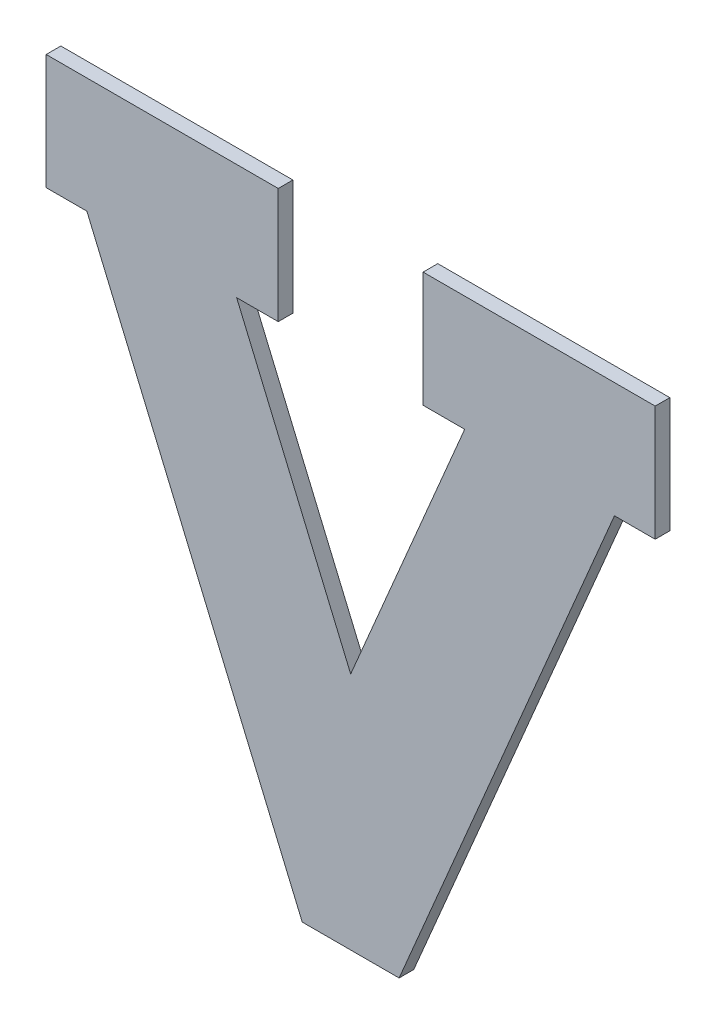
ISO-10303-21;
HEADER;
FILE_DESCRIPTION(('STEP AP214'),'2;1');
FILE_NAME('part.step','',(''),(''),'','','');
FILE_SCHEMA(('AUTOMOTIVE_DESIGN { 1 0 10303 214 1 1 1 1 }'));
ENDSEC;
DATA;
#1=APPLICATION_CONTEXT('core data for automotive mechanical design processes');
#2=APPLICATION_PROTOCOL_DEFINITION('international standard','automotive_design',2000,#1);
#3=PRODUCT_CONTEXT('',#1,'mechanical');
#4=PRODUCT('Part','Part','',(#3));
#5=PRODUCT_RELATED_PRODUCT_CATEGORY('part','',(#4));
#6=PRODUCT_DEFINITION_FORMATION('','',#4);
#7=PRODUCT_DEFINITION_CONTEXT('part definition',#1,'design');
#8=PRODUCT_DEFINITION('design','',#6,#7);
#9=PRODUCT_DEFINITION_SHAPE('','',#8);
#10=(LENGTH_UNIT() NAMED_UNIT(*) SI_UNIT(.MILLI.,.METRE.));
#11=(NAMED_UNIT(*) PLANE_ANGLE_UNIT() SI_UNIT($,.RADIAN.));
#12=(NAMED_UNIT(*) SI_UNIT($,.STERADIAN.) SOLID_ANGLE_UNIT());
#13=UNCERTAINTY_MEASURE_WITH_UNIT(LENGTH_MEASURE(1.E-05),#10,'distance_accuracy_value','');
#14=(GEOMETRIC_REPRESENTATION_CONTEXT(3) GLOBAL_UNCERTAINTY_ASSIGNED_CONTEXT((#13)) GLOBAL_UNIT_ASSIGNED_CONTEXT((#10,
#11,#12)) REPRESENTATION_CONTEXT('',''));
#15=CARTESIAN_POINT('',(0.,0.,0.));
#16=DIRECTION('',(0.,0.,1.));
#17=DIRECTION('',(1.,0.,0.));
#18=AXIS2_PLACEMENT_3D('',#15,#16,#17);
#19=CARTESIAN_POINT('',(203.379474991079,86.2207250585624,12.7));
#20=DIRECTION('',(-0.920681809264998,-0.39031398397768,0.));
#21=DIRECTION('',(0.390313983977681,-0.920681809264999,0.));
#22=AXIS2_PLACEMENT_3D('',#19,#20,#21);
#23=PLANE('',#22);
#24=DIRECTION('',(-0.390313983977681,0.920681809264999,0.));
#25=VECTOR('',#24,1.);
#26=CARTESIAN_POINT('',(203.379474991079,86.2207250585624,0.));
#27=LINE('',#26,#25);
#28=CARTESIAN_POINT('',(234.547862173014,12.7,0.));
#29=VERTEX_POINT('',#28);
#30=CARTESIAN_POINT('',(47.969245830039,452.806030314898,0.));
#31=VERTEX_POINT('',#30);
#32=EDGE_CURVE('E168',#29,#31,#27,.T.);
#33=ORIENTED_EDGE('',*,*,#32,.F.);
#34=DIRECTION('',(0.,0.,-1.));
#35=VECTOR('',#34,1.);
#36=CARTESIAN_POINT('',(234.547862173014,12.7,12.7));
#37=LINE('',#36,#35);
#38=CARTESIAN_POINT('',(234.547862173014,12.7,12.7));
#39=VERTEX_POINT('',#38);
#40=EDGE_CURVE('E11',#39,#29,#37,.T.);
#41=ORIENTED_EDGE('',*,*,#40,.F.);
#42=DIRECTION('',(-0.390313983977681,0.920681809264999,0.));
#43=VECTOR('',#42,1.);
#44=CARTESIAN_POINT('',(203.379474991079,86.2207250585624,12.7));
#45=LINE('',#44,#43);
#46=CARTESIAN_POINT('',(47.969245830039,452.806030314898,12.7));
#47=VERTEX_POINT('',#46);
#48=EDGE_CURVE('E209',#39,#47,#45,.T.);
#49=ORIENTED_EDGE('',*,*,#48,.T.);
#50=DIRECTION('',(0.,0.,-1.));
#51=VECTOR('',#50,1.);
#52=CARTESIAN_POINT('',(47.969245830039,452.806030314898,12.7));
#53=LINE('',#52,#51);
#54=EDGE_CURVE('E49',#47,#31,#53,.T.);
#55=ORIENTED_EDGE('',*,*,#54,.T.);
#56=EDGE_LOOP('',(#33,#41,#49,#55));
#57=FACE_BOUND('',#56,.T.);
#58=ADVANCED_FACE('F33',(#57),#23,.T.);
#59=CARTESIAN_POINT('',(0.,12.7,12.7));
#60=DIRECTION('',(0.,-1.,0.));
#61=DIRECTION('',(1.,0.,0.));
#62=AXIS2_PLACEMENT_3D('',#59,#60,#61);
#63=PLANE('',#62);
#64=DIRECTION('',(-1.,0.,0.));
#65=VECTOR('',#64,1.);
#66=CARTESIAN_POINT('',(0.,12.7,0.));
#67=LINE('',#66,#65);
#68=CARTESIAN_POINT('',(318.4864202364,12.6999999999999,0.));
#69=VERTEX_POINT('',#68);
#70=EDGE_CURVE('E170',#69,#29,#67,.T.);
#71=ORIENTED_EDGE('',*,*,#70,.F.);
#72=DIRECTION('',(0.,0.,-1.));
#73=VECTOR('',#72,1.);
#74=CARTESIAN_POINT('',(318.4864202364,12.6999999999999,12.7));
#75=LINE('',#74,#73);
#76=CARTESIAN_POINT('',(318.4864202364,12.6999999999999,12.7));
#77=VERTEX_POINT('',#76);
#78=EDGE_CURVE('E41',#77,#69,#75,.T.);
#79=ORIENTED_EDGE('',*,*,#78,.F.);
#80=DIRECTION('',(-1.,0.,0.));
#81=VECTOR('',#80,1.);
#82=CARTESIAN_POINT('',(0.,12.7,12.7));
#83=LINE('',#82,#81);
#84=EDGE_CURVE('E252',#77,#39,#83,.T.);
#85=ORIENTED_EDGE('',*,*,#84,.T.);
#86=ORIENTED_EDGE('',*,*,#40,.T.);
#87=EDGE_LOOP('',(#71,#79,#85,#86));
#88=FACE_BOUND('',#87,.T.);
#89=ADVANCED_FACE('F240',(#88),#63,.T.);
#90=CARTESIAN_POINT('',(265.402796297507,-112.514901173507,12.7));
#91=DIRECTION('',(0.920681809264998,-0.39031398397768,0.));
#92=DIRECTION('',(0.390313983977681,0.920681809264999,0.));
#93=AXIS2_PLACEMENT_3D('',#90,#91,#92);
#94=PLANE('',#93);
#95=DIRECTION('',(-0.390313983977681,-0.920681809264999,0.));
#96=VECTOR('',#95,1.);
#97=CARTESIAN_POINT('',(265.402796297507,-112.514901173507,0.));
#98=LINE('',#97,#96);
#99=CARTESIAN_POINT('',(505.065036579375,452.806030314899,0.));
#100=VERTEX_POINT('',#99);
#101=EDGE_CURVE('E173',#100,#69,#98,.T.);
#102=ORIENTED_EDGE('',*,*,#101,.F.);
#103=DIRECTION('',(0.,0.,-1.));
#104=VECTOR('',#103,1.);
#105=CARTESIAN_POINT('',(505.065036579375,452.806030314899,12.7));
#106=LINE('',#105,#104);
#107=CARTESIAN_POINT('',(505.065036579375,452.806030314899,12.7));
#108=VERTEX_POINT('',#107);
#109=EDGE_CURVE('E229',#108,#100,#106,.T.);
#110=ORIENTED_EDGE('',*,*,#109,.F.);
#111=DIRECTION('',(-0.390313983977681,-0.920681809264999,0.));
#112=VECTOR('',#111,1.);
#113=CARTESIAN_POINT('',(265.402796297507,-112.514901173507,12.7));
#114=LINE('',#113,#112);
#115=EDGE_CURVE('E236',#108,#77,#114,.T.);
#116=ORIENTED_EDGE('',*,*,#115,.T.);
#117=ORIENTED_EDGE('',*,*,#78,.T.);
#118=EDGE_LOOP('',(#102,#110,#116,#117));
#119=FACE_BOUND('',#118,.T.);
#120=ADVANCED_FACE('F234',(#119),#94,.T.);
#121=CARTESIAN_POINT('',(-1.42536555209397E-12,452.806030314897,12.7));
#122=DIRECTION('',(0.,-1.,0.));
#123=DIRECTION('',(1.,0.,0.));
#124=AXIS2_PLACEMENT_3D('',#121,#122,#123);
#125=PLANE('',#124);
#126=DIRECTION('',(-1.,0.,0.));
#127=VECTOR('',#126,1.);
#128=CARTESIAN_POINT('',(-1.42536555209397E-12,452.806030314897,0.));
#129=LINE('',#128,#127);
#130=CARTESIAN_POINT('',(540.334282409414,452.806030314899,0.));
#131=VERTEX_POINT('',#130);
#132=EDGE_CURVE('E176',#131,#100,#129,.T.);
#133=ORIENTED_EDGE('',*,*,#132,.F.);
#134=DIRECTION('',(0.,0.,-1.));
#135=VECTOR('',#134,1.);
#136=CARTESIAN_POINT('',(540.334282409414,452.806030314899,12.7));
#137=LINE('',#136,#135);
#138=CARTESIAN_POINT('',(540.334282409414,452.806030314899,12.7));
#139=VERTEX_POINT('',#138);
#140=EDGE_CURVE('E227',#139,#131,#137,.T.);
#141=ORIENTED_EDGE('',*,*,#140,.F.);
#142=DIRECTION('',(-1.,0.,0.));
#143=VECTOR('',#142,1.);
#144=CARTESIAN_POINT('',(-1.42536555209397E-12,452.806030314897,12.7));
#145=LINE('',#144,#143);
#146=EDGE_CURVE('E249',#139,#108,#145,.T.);
#147=ORIENTED_EDGE('',*,*,#146,.T.);
#148=ORIENTED_EDGE('',*,*,#109,.T.);
#149=EDGE_LOOP('',(#133,#141,#147,#148));
#150=FACE_BOUND('',#149,.T.);
#151=ADVANCED_FACE('F246',(#150),#125,.T.);
#152=CARTESIAN_POINT('',(540.334282409414,0.,12.7));
#153=DIRECTION('',(1.,0.,0.));
#154=DIRECTION('',(0.,0.,-1.));
#155=AXIS2_PLACEMENT_3D('',#152,#153,#154);
#156=PLANE('',#155);
#157=DIRECTION('',(0.,-1.,0.));
#158=VECTOR('',#157,1.);
#159=CARTESIAN_POINT('',(540.334282409414,0.,0.));
#160=LINE('',#159,#158);
#161=CARTESIAN_POINT('',(540.334282409414,552.754374559854,0.));
#162=VERTEX_POINT('',#161);
#163=EDGE_CURVE('E179',#162,#131,#160,.T.);
#164=ORIENTED_EDGE('',*,*,#163,.F.);
#165=DIRECTION('',(0.,0.,-1.));
#166=VECTOR('',#165,1.);
#167=CARTESIAN_POINT('',(540.334282409414,552.754374559854,12.7));
#168=LINE('',#167,#166);
#169=CARTESIAN_POINT('',(540.334282409414,552.754374559854,12.7));
#170=VERTEX_POINT('',#169);
#171=EDGE_CURVE('E225',#170,#162,#168,.T.);
#172=ORIENTED_EDGE('',*,*,#171,.F.);
#173=DIRECTION('',(0.,-1.,0.));
#174=VECTOR('',#173,1.);
#175=CARTESIAN_POINT('',(540.334282409414,0.,12.7));
#176=LINE('',#175,#174);
#177=EDGE_CURVE('E254',#170,#139,#176,.T.);
#178=ORIENTED_EDGE('',*,*,#177,.T.);
#179=ORIENTED_EDGE('',*,*,#140,.T.);
#180=EDGE_LOOP('',(#164,#172,#178,#179));
#181=FACE_BOUND('',#180,.T.);
#182=ADVANCED_FACE('F302',(#181),#156,.T.);
#183=CARTESIAN_POINT('',(0.,552.754374559854,12.7));
#184=DIRECTION('',(0.,1.,0.));
#185=DIRECTION('',(0.,0.,1.));
#186=AXIS2_PLACEMENT_3D('',#183,#184,#185);
#187=PLANE('',#186);
#188=DIRECTION('',(1.,0.,0.));
#189=VECTOR('',#188,1.);
#190=CARTESIAN_POINT('',(0.,552.754374559854,0.));
#191=LINE('',#190,#189);
#192=CARTESIAN_POINT('',(339.275403870144,552.754374559854,0.));
#193=VERTEX_POINT('',#192);
#194=EDGE_CURVE('E182',#193,#162,#191,.T.);
#195=ORIENTED_EDGE('',*,*,#194,.F.);
#196=DIRECTION('',(0.,0.,-1.));
#197=VECTOR('',#196,1.);
#198=CARTESIAN_POINT('',(339.275403870144,552.754374559854,12.7));
#199=LINE('',#198,#197);
#200=CARTESIAN_POINT('',(339.275403870144,552.754374559854,12.7));
#201=VERTEX_POINT('',#200);
#202=EDGE_CURVE('E223',#201,#193,#199,.T.);
#203=ORIENTED_EDGE('',*,*,#202,.F.);
#204=DIRECTION('',(1.,0.,0.));
#205=VECTOR('',#204,1.);
#206=CARTESIAN_POINT('',(0.,552.754374559854,12.7));
#207=LINE('',#206,#205);
#208=EDGE_CURVE('E260',#201,#170,#207,.T.);
#209=ORIENTED_EDGE('',*,*,#208,.T.);
#210=ORIENTED_EDGE('',*,*,#171,.T.);
#211=EDGE_LOOP('',(#195,#203,#209,#210));
#212=FACE_BOUND('',#211,.T.);
#213=ADVANCED_FACE('F305',(#212),#187,.T.);
#214=CARTESIAN_POINT('',(339.275403870143,-3.76866038063101E-13,12.7));
#215=DIRECTION('',(-1.,0.,0.));
#216=DIRECTION('',(0.,-1.,0.));
#217=AXIS2_PLACEMENT_3D('',#214,#215,#216);
#218=PLANE('',#217);
#219=DIRECTION('',(0.,1.,0.));
#220=VECTOR('',#219,1.);
#221=CARTESIAN_POINT('',(339.275403870143,-3.76866038063101E-13,0.));
#222=LINE('',#221,#220);
#223=CARTESIAN_POINT('',(339.275403870144,452.806030314898,0.));
#224=VERTEX_POINT('',#223);
#225=EDGE_CURVE('E185',#224,#193,#222,.T.);
#226=ORIENTED_EDGE('',*,*,#225,.F.);
#227=DIRECTION('',(0.,0.,-1.));
#228=VECTOR('',#227,1.);
#229=CARTESIAN_POINT('',(339.275403870144,452.806030314898,12.7));
#230=LINE('',#229,#228);
#231=CARTESIAN_POINT('',(339.275403870144,452.806030314898,12.7));
#232=VERTEX_POINT('',#231);
#233=EDGE_CURVE('E221',#232,#224,#230,.T.);
#234=ORIENTED_EDGE('',*,*,#233,.F.);
#235=DIRECTION('',(0.,1.,0.));
#236=VECTOR('',#235,1.);
#237=CARTESIAN_POINT('',(339.275403870143,-3.76866038063101E-13,12.7));
#238=LINE('',#237,#236);
#239=EDGE_CURVE('E263',#232,#201,#238,.T.);
#240=ORIENTED_EDGE('',*,*,#239,.T.);
#241=ORIENTED_EDGE('',*,*,#202,.T.);
#242=EDGE_LOOP('',(#226,#234,#240,#241));
#243=FACE_BOUND('',#242,.T.);
#244=ADVANCED_FACE('F309',(#243),#218,.T.);
#245=CARTESIAN_POINT('',(6.97675688464734E-13,452.806030314899,12.7));
#246=DIRECTION('',(0.,-1.,0.));
#247=DIRECTION('',(1.,0.,0.));
#248=AXIS2_PLACEMENT_3D('',#245,#246,#247);
#249=PLANE('',#248);
#250=DIRECTION('',(-1.,0.,0.));
#251=VECTOR('',#250,1.);
#252=CARTESIAN_POINT('',(6.97675688464734E-13,452.806030314899,0.));
#253=LINE('',#252,#251);
#254=CARTESIAN_POINT('',(375.303295400302,452.806030314898,0.));
#255=VERTEX_POINT('',#254);
#256=EDGE_CURVE('E188',#255,#224,#253,.T.);
#257=ORIENTED_EDGE('',*,*,#256,.F.);
#258=DIRECTION('',(0.,0.,-1.));
#259=VECTOR('',#258,1.);
#260=CARTESIAN_POINT('',(375.303295400302,452.806030314898,12.7));
#261=LINE('',#260,#259);
#262=CARTESIAN_POINT('',(375.303295400302,452.806030314898,12.7));
#263=VERTEX_POINT('',#262);
#264=EDGE_CURVE('E219',#263,#255,#261,.T.);
#265=ORIENTED_EDGE('',*,*,#264,.F.);
#266=DIRECTION('',(-1.,0.,0.));
#267=VECTOR('',#266,1.);
#268=CARTESIAN_POINT('',(6.97675688464734E-13,452.806030314899,12.7));
#269=LINE('',#268,#267);
#270=EDGE_CURVE('E266',#263,#232,#269,.T.);
#271=ORIENTED_EDGE('',*,*,#270,.T.);
#272=ORIENTED_EDGE('',*,*,#233,.T.);
#273=EDGE_LOOP('',(#257,#265,#271,#272));
#274=FACE_BOUND('',#273,.T.);
#275=ADVANCED_FACE('F313',(#274),#249,.T.);
#276=CARTESIAN_POINT('',(155.409608368419,-65.8843726250153,12.7));
#277=DIRECTION('',(-0.920681809264999,0.39031398397768,0.));
#278=DIRECTION('',(-0.39031398397768,-0.920681809264999,0.));
#279=AXIS2_PLACEMENT_3D('',#276,#277,#278);
#280=PLANE('',#279);
#281=DIRECTION('',(0.39031398397768,0.920681809264999,0.));
#282=VECTOR('',#281,1.);
#283=CARTESIAN_POINT('',(155.409608368419,-65.8843726250153,0.));
#284=LINE('',#283,#282);
#285=CARTESIAN_POINT('',(276.517141204707,219.78692541823,0.));
#286=VERTEX_POINT('',#285);
#287=EDGE_CURVE('E191',#286,#255,#284,.T.);
#288=ORIENTED_EDGE('',*,*,#287,.F.);
#289=DIRECTION('',(0.,0.,-1.));
#290=VECTOR('',#289,1.);
#291=CARTESIAN_POINT('',(276.517141204707,219.78692541823,12.7));
#292=LINE('',#291,#290);
#293=CARTESIAN_POINT('',(276.517141204707,219.78692541823,12.7));
#294=VERTEX_POINT('',#293);
#295=EDGE_CURVE('E217',#294,#286,#292,.T.);
#296=ORIENTED_EDGE('',*,*,#295,.F.);
#297=DIRECTION('',(0.39031398397768,0.920681809264999,0.));
#298=VECTOR('',#297,1.);
#299=CARTESIAN_POINT('',(155.409608368419,-65.8843726250153,12.7));
#300=LINE('',#299,#298);
#301=EDGE_CURVE('E269',#294,#263,#300,.T.);
#302=ORIENTED_EDGE('',*,*,#301,.T.);
#303=ORIENTED_EDGE('',*,*,#264,.T.);
#304=EDGE_LOOP('',(#288,#296,#302,#303));
#305=FACE_BOUND('',#304,.T.);
#306=ADVANCED_FACE('F317',(#305),#280,.T.);
#307=CARTESIAN_POINT('',(313.372662920168,132.851253607054,12.7));
#308=DIRECTION('',(0.920681809264999,0.39031398397768,0.));
#309=DIRECTION('',(-0.39031398397768,0.920681809264999,0.));
#310=AXIS2_PLACEMENT_3D('',#307,#308,#309);
#311=PLANE('',#310);
#312=DIRECTION('',(0.39031398397768,-0.920681809264999,0.));
#313=VECTOR('',#312,1.);
#314=CARTESIAN_POINT('',(313.372662920168,132.851253607054,0.));
#315=LINE('',#314,#313);
#316=CARTESIAN_POINT('',(177.730987009112,452.806030314898,0.));
#317=VERTEX_POINT('',#316);
#318=EDGE_CURVE('E194',#317,#286,#315,.T.);
#319=ORIENTED_EDGE('',*,*,#318,.F.);
#320=DIRECTION('',(0.,0.,-1.));
#321=VECTOR('',#320,1.);
#322=CARTESIAN_POINT('',(177.730987009112,452.806030314898,12.7));
#323=LINE('',#322,#321);
#324=CARTESIAN_POINT('',(177.730987009112,452.806030314898,12.7));
#325=VERTEX_POINT('',#324);
#326=EDGE_CURVE('E215',#325,#317,#323,.T.);
#327=ORIENTED_EDGE('',*,*,#326,.F.);
#328=DIRECTION('',(0.39031398397768,-0.920681809264999,0.));
#329=VECTOR('',#328,1.);
#330=CARTESIAN_POINT('',(313.372662920168,132.851253607054,12.7));
#331=LINE('',#330,#329);
#332=EDGE_CURVE('E272',#325,#294,#331,.T.);
#333=ORIENTED_EDGE('',*,*,#332,.T.);
#334=ORIENTED_EDGE('',*,*,#295,.T.);
#335=EDGE_LOOP('',(#319,#327,#333,#334));
#336=FACE_BOUND('',#335,.T.);
#337=ADVANCED_FACE('F321',(#336),#311,.T.);
#338=CARTESIAN_POINT('',(6.97675688464734E-13,452.806030314899,12.7));
#339=DIRECTION('',(0.,-1.,0.));
#340=DIRECTION('',(1.,0.,0.));
#341=AXIS2_PLACEMENT_3D('',#338,#339,#340);
#342=PLANE('',#341);
#343=DIRECTION('',(-1.,0.,0.));
#344=VECTOR('',#343,1.);
#345=CARTESIAN_POINT('',(6.97675688464734E-13,452.806030314899,0.));
#346=LINE('',#345,#344);
#347=CARTESIAN_POINT('',(213.75887853927,452.806030314898,0.));
#348=VERTEX_POINT('',#347);
#349=EDGE_CURVE('E197',#348,#317,#346,.T.);
#350=ORIENTED_EDGE('',*,*,#349,.F.);
#351=DIRECTION('',(0.,0.,-1.));
#352=VECTOR('',#351,1.);
#353=CARTESIAN_POINT('',(213.75887853927,452.806030314898,12.7));
#354=LINE('',#353,#352);
#355=CARTESIAN_POINT('',(213.75887853927,452.806030314898,12.7));
#356=VERTEX_POINT('',#355);
#357=EDGE_CURVE('E213',#356,#348,#354,.T.);
#358=ORIENTED_EDGE('',*,*,#357,.F.);
#359=DIRECTION('',(-1.,0.,0.));
#360=VECTOR('',#359,1.);
#361=CARTESIAN_POINT('',(6.97675688464734E-13,452.806030314899,12.7));
#362=LINE('',#361,#360);
#363=EDGE_CURVE('E275',#356,#325,#362,.T.);
#364=ORIENTED_EDGE('',*,*,#363,.T.);
#365=ORIENTED_EDGE('',*,*,#326,.T.);
#366=EDGE_LOOP('',(#350,#358,#364,#365));
#367=FACE_BOUND('',#366,.T.);
#368=ADVANCED_FACE('F325',(#367),#342,.T.);
#369=CARTESIAN_POINT('',(213.75887853927,1.18721340741134E-13,12.7));
#370=DIRECTION('',(1.,0.,0.));
#371=DIRECTION('',(0.,1.,0.));
#372=AXIS2_PLACEMENT_3D('',#369,#370,#371);
#373=PLANE('',#372);
#374=DIRECTION('',(0.,-1.,0.));
#375=VECTOR('',#374,1.);
#376=CARTESIAN_POINT('',(213.75887853927,1.18721340741134E-13,0.));
#377=LINE('',#376,#375);
#378=CARTESIAN_POINT('',(213.75887853927,552.754374559854,0.));
#379=VERTEX_POINT('',#378);
#380=EDGE_CURVE('E200',#379,#348,#377,.T.);
#381=ORIENTED_EDGE('',*,*,#380,.F.);
#382=DIRECTION('',(0.,0.,-1.));
#383=VECTOR('',#382,1.);
#384=CARTESIAN_POINT('',(213.75887853927,552.754374559854,12.7));
#385=LINE('',#384,#383);
#386=CARTESIAN_POINT('',(213.75887853927,552.754374559854,12.7));
#387=VERTEX_POINT('',#386);
#388=EDGE_CURVE('E150',#387,#379,#385,.T.);
#389=ORIENTED_EDGE('',*,*,#388,.F.);
#390=DIRECTION('',(0.,-1.,0.));
#391=VECTOR('',#390,1.);
#392=CARTESIAN_POINT('',(213.75887853927,1.18721340741134E-13,12.7));
#393=LINE('',#392,#391);
#394=EDGE_CURVE('E160',#387,#356,#393,.T.);
#395=ORIENTED_EDGE('',*,*,#394,.T.);
#396=ORIENTED_EDGE('',*,*,#357,.T.);
#397=EDGE_LOOP('',(#381,#389,#395,#396));
#398=FACE_BOUND('',#397,.T.);
#399=ADVANCED_FACE('F279',(#398),#373,.T.);
#400=CARTESIAN_POINT('',(0.,552.754374559854,12.7));
#401=DIRECTION('',(0.,1.,0.));
#402=DIRECTION('',(0.,0.,1.));
#403=AXIS2_PLACEMENT_3D('',#400,#401,#402);
#404=PLANE('',#403);
#405=DIRECTION('',(1.,0.,0.));
#406=VECTOR('',#405,1.);
#407=CARTESIAN_POINT('',(0.,552.754374559854,0.));
#408=LINE('',#407,#406);
#409=CARTESIAN_POINT('',(12.7,552.754374559854,0.));
#410=VERTEX_POINT('',#409);
#411=EDGE_CURVE('E146',#410,#379,#408,.T.);
#412=ORIENTED_EDGE('',*,*,#411,.F.);
#413=DIRECTION('',(0.,0.,-1.));
#414=VECTOR('',#413,1.);
#415=CARTESIAN_POINT('',(12.7,552.754374559854,12.7));
#416=LINE('',#415,#414);
#417=CARTESIAN_POINT('',(12.7,552.754374559854,12.7));
#418=VERTEX_POINT('',#417);
#419=EDGE_CURVE('E141',#418,#410,#416,.T.);
#420=ORIENTED_EDGE('',*,*,#419,.F.);
#421=DIRECTION('',(1.,0.,0.));
#422=VECTOR('',#421,1.);
#423=CARTESIAN_POINT('',(0.,552.754374559854,12.7));
#424=LINE('',#423,#422);
#425=EDGE_CURVE('E144',#418,#387,#424,.T.);
#426=ORIENTED_EDGE('',*,*,#425,.T.);
#427=ORIENTED_EDGE('',*,*,#388,.T.);
#428=EDGE_LOOP('',(#412,#420,#426,#427));
#429=FACE_BOUND('',#428,.T.);
#430=ADVANCED_FACE('F143',(#429),#404,.T.);
#431=CARTESIAN_POINT('',(12.7,0.,12.7));
#432=DIRECTION('',(-1.,0.,0.));
#433=DIRECTION('',(0.,0.,1.));
#434=AXIS2_PLACEMENT_3D('',#431,#432,#433);
#435=PLANE('',#434);
#436=DIRECTION('',(0.,1.,0.));
#437=VECTOR('',#436,1.);
#438=CARTESIAN_POINT('',(12.7,0.,0.));
#439=LINE('',#438,#437);
#440=CARTESIAN_POINT('',(12.7,452.806030314899,0.));
#441=VERTEX_POINT('',#440);
#442=EDGE_CURVE('E204',#441,#410,#439,.T.);
#443=ORIENTED_EDGE('',*,*,#442,.F.);
#444=DIRECTION('',(0.,0.,-1.));
#445=VECTOR('',#444,1.);
#446=CARTESIAN_POINT('',(12.7,452.806030314899,12.7));
#447=LINE('',#446,#445);
#448=CARTESIAN_POINT('',(12.7,452.806030314899,12.7));
#449=VERTEX_POINT('',#448);
#450=EDGE_CURVE('E95',#449,#441,#447,.T.);
#451=ORIENTED_EDGE('',*,*,#450,.F.);
#452=DIRECTION('',(0.,1.,0.));
#453=VECTOR('',#452,1.);
#454=CARTESIAN_POINT('',(12.7,0.,12.7));
#455=LINE('',#454,#453);
#456=EDGE_CURVE('E157',#449,#418,#455,.T.);
#457=ORIENTED_EDGE('',*,*,#456,.T.);
#458=ORIENTED_EDGE('',*,*,#419,.T.);
#459=EDGE_LOOP('',(#443,#451,#457,#458));
#460=FACE_BOUND('',#459,.T.);
#461=ADVANCED_FACE('F162',(#460),#435,.T.);
#462=CARTESIAN_POINT('',(7.12682776046987E-13,452.806030314899,12.7));
#463=DIRECTION('',(0.,-1.,0.));
#464=DIRECTION('',(1.,0.,0.));
#465=AXIS2_PLACEMENT_3D('',#462,#463,#464);
#466=PLANE('',#465);
#467=DIRECTION('',(-1.,0.,0.));
#468=VECTOR('',#467,1.);
#469=CARTESIAN_POINT('',(7.12682776046987E-13,452.806030314899,0.));
#470=LINE('',#469,#468);
#471=EDGE_CURVE('E206',#31,#441,#470,.T.);
#472=ORIENTED_EDGE('',*,*,#471,.F.);
#473=ORIENTED_EDGE('',*,*,#54,.F.);
#474=DIRECTION('',(-1.,0.,0.));
#475=VECTOR('',#474,1.);
#476=CARTESIAN_POINT('',(7.12682776046987E-13,452.806030314899,12.7));
#477=LINE('',#476,#475);
#478=EDGE_CURVE('E163',#47,#449,#477,.T.);
#479=ORIENTED_EDGE('',*,*,#478,.T.);
#480=ORIENTED_EDGE('',*,*,#450,.T.);
#481=EDGE_LOOP('',(#472,#473,#479,#480));
#482=FACE_BOUND('',#481,.T.);
#483=ADVANCED_FACE('F281',(#482),#466,.T.);
#484=CARTESIAN_POINT('',(0.,0.,12.7));
#485=DIRECTION('',(0.,0.,1.));
#486=DIRECTION('',(1.,0.,0.));
#487=AXIS2_PLACEMENT_3D('',#484,#485,#486);
#488=PLANE('',#487);
#489=ORIENTED_EDGE('',*,*,#48,.F.);
#490=ORIENTED_EDGE('',*,*,#84,.F.);
#491=ORIENTED_EDGE('',*,*,#115,.F.);
#492=ORIENTED_EDGE('',*,*,#146,.F.);
#493=ORIENTED_EDGE('',*,*,#177,.F.);
#494=ORIENTED_EDGE('',*,*,#208,.F.);
#495=ORIENTED_EDGE('',*,*,#239,.F.);
#496=ORIENTED_EDGE('',*,*,#270,.F.);
#497=ORIENTED_EDGE('',*,*,#301,.F.);
#498=ORIENTED_EDGE('',*,*,#332,.F.);
#499=ORIENTED_EDGE('',*,*,#363,.F.);
#500=ORIENTED_EDGE('',*,*,#394,.F.);
#501=ORIENTED_EDGE('',*,*,#425,.F.);
#502=ORIENTED_EDGE('',*,*,#456,.F.);
#503=ORIENTED_EDGE('',*,*,#478,.F.);
#504=EDGE_LOOP('',(#489,#490,#491,#492,#493,#494,#495,#496,#497,#498,#499,#500,#501,#502,#503));
#505=FACE_BOUND('',#504,.T.);
#506=ADVANCED_FACE('F155',(#505),#488,.T.);
#507=CARTESIAN_POINT('',(0.,0.,0.));
#508=DIRECTION('',(0.,0.,1.));
#509=DIRECTION('',(1.,0.,0.));
#510=AXIS2_PLACEMENT_3D('',#507,#508,#509);
#511=PLANE('',#510);
#512=ORIENTED_EDGE('',*,*,#32,.T.);
#513=ORIENTED_EDGE('',*,*,#471,.T.);
#514=ORIENTED_EDGE('',*,*,#442,.T.);
#515=ORIENTED_EDGE('',*,*,#411,.T.);
#516=ORIENTED_EDGE('',*,*,#380,.T.);
#517=ORIENTED_EDGE('',*,*,#349,.T.);
#518=ORIENTED_EDGE('',*,*,#318,.T.);
#519=ORIENTED_EDGE('',*,*,#287,.T.);
#520=ORIENTED_EDGE('',*,*,#256,.T.);
#521=ORIENTED_EDGE('',*,*,#225,.T.);
#522=ORIENTED_EDGE('',*,*,#194,.T.);
#523=ORIENTED_EDGE('',*,*,#163,.T.);
#524=ORIENTED_EDGE('',*,*,#132,.T.);
#525=ORIENTED_EDGE('',*,*,#101,.T.);
#526=ORIENTED_EDGE('',*,*,#70,.T.);
#527=EDGE_LOOP('',(#512,#513,#514,#515,#516,#517,#518,#519,#520,#521,#522,#523,#524,#525,#526));
#528=FACE_BOUND('',#527,.T.);
#529=ADVANCED_FACE('F242',(#528),#511,.F.);
#530=CLOSED_SHELL('',(#58,#89,#120,#151,#182,#213,#244,#275,#306,#337,#368,#399,#430,#461,#483,
#506,#529));
#531=MANIFOLD_SOLID_BREP('B2',#530);
#532=ADVANCED_BREP_SHAPE_REPRESENTATION('',(#18,#531),#14);
#533=SHAPE_DEFINITION_REPRESENTATION(#9,#532);
ENDSEC;
END-ISO-10303-21;
